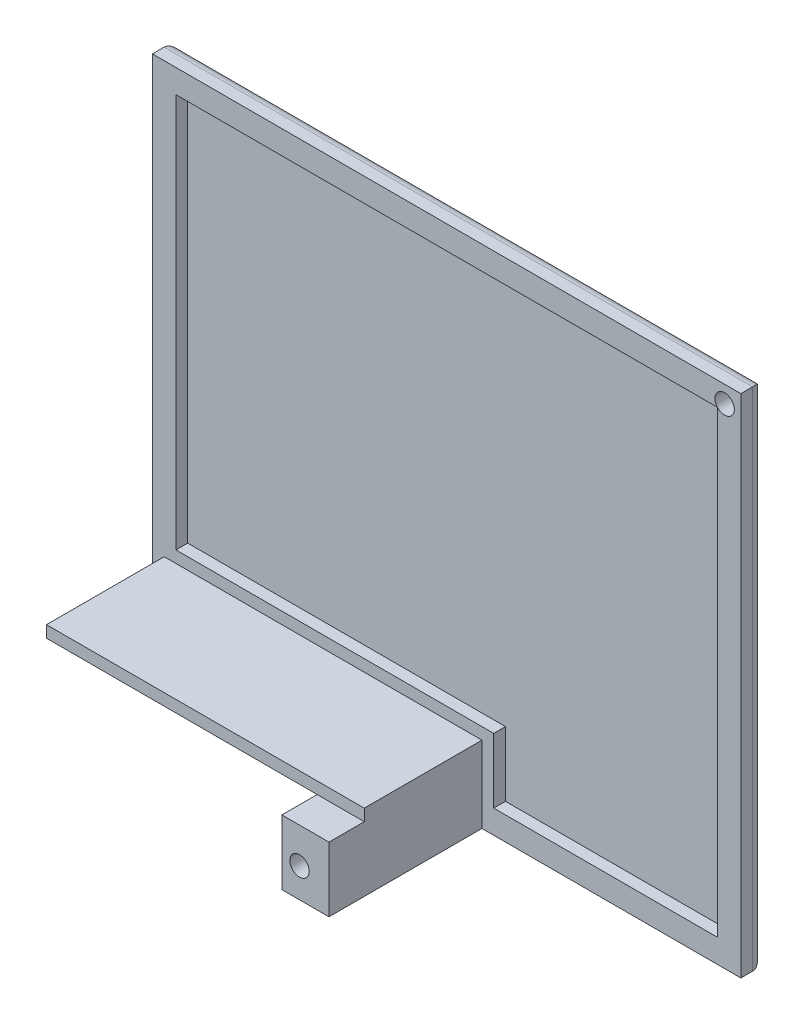
ISO-10303-21;
HEADER;
FILE_DESCRIPTION(('STEP AP214'),'2;1');
FILE_NAME('part.step','',(''),(''),'','','');
FILE_SCHEMA(('AUTOMOTIVE_DESIGN { 1 0 10303 214 1 1 1 1 }'));
ENDSEC;
DATA;
#1=APPLICATION_CONTEXT('core data for automotive mechanical design processes');
#2=APPLICATION_PROTOCOL_DEFINITION('international standard','automotive_design',2000,#1);
#3=PRODUCT_CONTEXT('',#1,'mechanical');
#4=PRODUCT('Part','Part','',(#3));
#5=PRODUCT_RELATED_PRODUCT_CATEGORY('part','',(#4));
#6=PRODUCT_DEFINITION_FORMATION('','',#4);
#7=PRODUCT_DEFINITION_CONTEXT('part definition',#1,'design');
#8=PRODUCT_DEFINITION('design','',#6,#7);
#9=PRODUCT_DEFINITION_SHAPE('','',#8);
#10=(LENGTH_UNIT() NAMED_UNIT(*) SI_UNIT(.MILLI.,.METRE.));
#11=(NAMED_UNIT(*) PLANE_ANGLE_UNIT() SI_UNIT($,.RADIAN.));
#12=(NAMED_UNIT(*) SI_UNIT($,.STERADIAN.) SOLID_ANGLE_UNIT());
#13=UNCERTAINTY_MEASURE_WITH_UNIT(LENGTH_MEASURE(1.E-05),#10,'distance_accuracy_value','');
#14=(GEOMETRIC_REPRESENTATION_CONTEXT(3) GLOBAL_UNCERTAINTY_ASSIGNED_CONTEXT((#13)) GLOBAL_UNIT_ASSIGNED_CONTEXT((#10,
#11,#12)) REPRESENTATION_CONTEXT('',''));
#15=CARTESIAN_POINT('',(0.,0.,0.));
#16=DIRECTION('',(0.,0.,1.));
#17=DIRECTION('',(1.,0.,0.));
#18=AXIS2_PLACEMENT_3D('',#15,#16,#17);
#19=CARTESIAN_POINT('',(0.,0.,-45.));
#20=DIRECTION('',(0.,0.,-1.));
#21=DIRECTION('',(-1.,0.,0.));
#22=AXIS2_PLACEMENT_3D('',#19,#20,#21);
#23=PLANE('',#22);
#24=DIRECTION('',(1.,0.,0.));
#25=VECTOR('',#24,1.);
#26=CARTESIAN_POINT('',(-64.6376811594203,62.9565217391305,-45.));
#27=LINE('',#26,#25);
#28=CARTESIAN_POINT('',(-64.6376811594203,62.9565217391305,-45.));
#29=VERTEX_POINT('',#28);
#30=CARTESIAN_POINT('',(35.3623188405797,62.9565217391305,-45.));
#31=VERTEX_POINT('',#30);
#32=EDGE_CURVE('E547',#29,#31,#27,.T.);
#33=ORIENTED_EDGE('',*,*,#32,.F.);
#34=DIRECTION('',(0.,1.,0.));
#35=VECTOR('',#34,1.);
#36=CARTESIAN_POINT('',(-64.6376811594203,62.9565217391305,-45.));
#37=LINE('',#36,#35);
#38=CARTESIAN_POINT('',(-64.6376811594203,-12.0434782608695,-45.));
#39=VERTEX_POINT('',#38);
#40=EDGE_CURVE('E282',#39,#29,#37,.T.);
#41=ORIENTED_EDGE('',*,*,#40,.F.);
#42=DIRECTION('',(1.,0.,0.));
#43=VECTOR('',#42,1.);
#44=CARTESIAN_POINT('',(-8.6376811594203,-12.0434782608695,-45.));
#45=LINE('',#44,#43);
#46=CARTESIAN_POINT('',(-62.6376811594203,-12.0434782608695,-45.));
#47=VERTEX_POINT('',#46);
#48=EDGE_CURVE('E285',#39,#47,#45,.T.);
#49=ORIENTED_EDGE('',*,*,#48,.T.);
#50=DIRECTION('',(0.,1.,0.));
#51=VECTOR('',#50,1.);
#52=CARTESIAN_POINT('',(-62.6376811594203,-21.0434782608695,-45.));
#53=LINE('',#52,#51);
#54=CARTESIAN_POINT('',(-62.6376811594203,-10.0434782608695,-45.));
#55=VERTEX_POINT('',#54);
#56=EDGE_CURVE('E275',#47,#55,#53,.T.);
#57=ORIENTED_EDGE('',*,*,#56,.T.);
#58=DIRECTION('',(1.,0.,0.));
#59=VECTOR('',#58,1.);
#60=CARTESIAN_POINT('',(0.,-10.0434782608695,-45.));
#61=LINE('',#60,#59);
#62=CARTESIAN_POINT('',(-8.6376811594203,-10.0434782608695,-45.));
#63=VERTEX_POINT('',#62);
#64=EDGE_CURVE('E318',#55,#63,#61,.T.);
#65=ORIENTED_EDGE('',*,*,#64,.T.);
#66=DIRECTION('',(0.,-1.,0.));
#67=VECTOR('',#66,1.);
#68=CARTESIAN_POINT('',(-8.6376811594203,0.,-45.));
#69=LINE('',#68,#67);
#70=CARTESIAN_POINT('',(-8.6376811594203,-23.0434782608695,-45.));
#71=VERTEX_POINT('',#70);
#72=EDGE_CURVE('E544',#63,#71,#69,.T.);
#73=ORIENTED_EDGE('',*,*,#72,.T.);
#74=DIRECTION('',(-1.,0.,0.));
#75=VECTOR('',#74,1.);
#76=CARTESIAN_POINT('',(-64.6376811594203,-23.0434782608695,-45.));
#77=LINE('',#76,#75);
#78=CARTESIAN_POINT('',(35.3623188405797,-23.0434782608695,-45.));
#79=VERTEX_POINT('',#78);
#80=EDGE_CURVE('E334',#79,#71,#77,.T.);
#81=ORIENTED_EDGE('',*,*,#80,.F.);
#82=DIRECTION('',(0.,-1.,0.));
#83=VECTOR('',#82,1.);
#84=CARTESIAN_POINT('',(35.3623188405797,62.9565217391305,-45.));
#85=LINE('',#84,#83);
#86=EDGE_CURVE('E346',#31,#79,#85,.T.);
#87=ORIENTED_EDGE('',*,*,#86,.F.);
#88=EDGE_LOOP('',(#33,#41,#49,#57,#65,#73,#81,#87));
#89=FACE_BOUND('',#88,.T.);
#90=CARTESIAN_POINT('',(32.6005254813833,60.0629949220613,-45.));
#91=DIRECTION('',(0.,0.,-1.));
#92=DIRECTION('',(-1.,0.,0.));
#93=AXIS2_PLACEMENT_3D('',#90,#91,#92);
#94=CIRCLE('',#93,1.65);
#95=CARTESIAN_POINT('',(30.9505254813833,60.0629949220613,-45.));
#96=VERTEX_POINT('',#95);
#97=EDGE_CURVE('E251',#96,#96,#94,.T.);
#98=ORIENTED_EDGE('',*,*,#97,.T.);
#99=EDGE_LOOP('',(#98));
#100=FACE_BOUND('',#99,.T.);
#101=DIRECTION('',(0.,-1.,0.));
#102=VECTOR('',#101,1.);
#103=CARTESIAN_POINT('',(31.3623188405797,-8.04347826086955,-45.));
#104=LINE('',#103,#102);
#105=CARTESIAN_POINT('',(31.3623188405797,58.9565217391305,-45.));
#106=VERTEX_POINT('',#105);
#107=CARTESIAN_POINT('',(31.3623188405797,-19.0434782608695,-45.));
#108=VERTEX_POINT('',#107);
#109=EDGE_CURVE('E226',#106,#108,#104,.T.);
#110=ORIENTED_EDGE('',*,*,#109,.T.);
#111=DIRECTION('',(-1.,0.,0.));
#112=VECTOR('',#111,1.);
#113=CARTESIAN_POINT('',(31.3623188405797,-19.0434782608695,-45.));
#114=LINE('',#113,#112);
#115=CARTESIAN_POINT('',(-6.63768115942029,-19.0434782608695,-45.));
#116=VERTEX_POINT('',#115);
#117=EDGE_CURVE('E208',#108,#116,#114,.T.);
#118=ORIENTED_EDGE('',*,*,#117,.T.);
#119=DIRECTION('',(0.,1.,0.));
#120=VECTOR('',#119,1.);
#121=CARTESIAN_POINT('',(-6.63768115942029,-8.04347826086954,-45.));
#122=LINE('',#121,#120);
#123=CARTESIAN_POINT('',(-6.63768115942029,-8.04347826086954,-45.));
#124=VERTEX_POINT('',#123);
#125=EDGE_CURVE('E229',#116,#124,#122,.T.);
#126=ORIENTED_EDGE('',*,*,#125,.T.);
#127=DIRECTION('',(-1.,0.,0.));
#128=VECTOR('',#127,1.);
#129=CARTESIAN_POINT('',(-6.63768115942029,-8.04347826086954,-45.));
#130=LINE('',#129,#128);
#131=CARTESIAN_POINT('',(-60.6376811594203,-8.04347826086955,-45.));
#132=VERTEX_POINT('',#131);
#133=EDGE_CURVE('E232',#124,#132,#130,.T.);
#134=ORIENTED_EDGE('',*,*,#133,.T.);
#135=DIRECTION('',(0.,1.,0.));
#136=VECTOR('',#135,1.);
#137=CARTESIAN_POINT('',(-60.6376811594203,58.9565217391305,-45.));
#138=LINE('',#137,#136);
#139=CARTESIAN_POINT('',(-60.6376811594203,58.9565217391305,-45.));
#140=VERTEX_POINT('',#139);
#141=EDGE_CURVE('E235',#132,#140,#138,.T.);
#142=ORIENTED_EDGE('',*,*,#141,.T.);
#143=DIRECTION('',(1.,0.,0.));
#144=VECTOR('',#143,1.);
#145=CARTESIAN_POINT('',(31.3623188405797,58.9565217391305,-45.));
#146=LINE('',#145,#144);
#147=EDGE_CURVE('E202',#140,#106,#146,.T.);
#148=ORIENTED_EDGE('',*,*,#147,.T.);
#149=EDGE_LOOP('',(#110,#118,#126,#134,#142,#148));
#150=FACE_BOUND('',#149,.T.);
#151=ADVANCED_FACE('F32',(#89,#100,#150),#23,.F.);
#152=CARTESIAN_POINT('',(-8.6376811594203,-12.0434782608695,-53.));
#153=DIRECTION('',(0.,-1.,0.));
#154=DIRECTION('',(0.,0.,-1.));
#155=AXIS2_PLACEMENT_3D('',#152,#153,#154);
#156=PLANE('',#155);
#157=DIRECTION('',(0.,0.,1.));
#158=VECTOR('',#157,1.);
#159=CARTESIAN_POINT('',(-64.6376811594203,-12.0434782608695,-53.));
#160=LINE('',#159,#158);
#161=CARTESIAN_POINT('',(-64.6376811594203,-12.0434782608695,-47.));
#162=VERTEX_POINT('',#161);
#163=EDGE_CURVE('E276',#162,#39,#160,.T.);
#164=ORIENTED_EDGE('',*,*,#163,.F.);
#165=DIRECTION('',(-1.,0.,0.));
#166=VECTOR('',#165,1.);
#167=CARTESIAN_POINT('',(-8.6376811594203,-12.0434782608695,-47.));
#168=LINE('',#167,#166);
#169=CARTESIAN_POINT('',(-10.6376811594203,-12.0434782608695,-47.));
#170=VERTEX_POINT('',#169);
#171=EDGE_CURVE('E387',#162,#170,#168,.F.);
#172=ORIENTED_EDGE('',*,*,#171,.T.);
#173=DIRECTION('',(0.,0.,-1.));
#174=VECTOR('',#173,1.);
#175=CARTESIAN_POINT('',(-10.6376811594203,-12.0434782608695,-21.));
#176=LINE('',#175,#174);
#177=CARTESIAN_POINT('',(-10.6376811594203,-12.0434782608695,-27.));
#178=VERTEX_POINT('',#177);
#179=EDGE_CURVE('E322',#178,#170,#176,.T.);
#180=ORIENTED_EDGE('',*,*,#179,.F.);
#181=DIRECTION('',(1.,0.,0.));
#182=VECTOR('',#181,1.);
#183=CARTESIAN_POINT('',(-10.6376811594203,-12.0434782608695,-27.));
#184=LINE('',#183,#182);
#185=CARTESIAN_POINT('',(-16.6376811594203,-12.0434782608695,-27.));
#186=VERTEX_POINT('',#185);
#187=EDGE_CURVE('E269',#186,#178,#184,.T.);
#188=ORIENTED_EDGE('',*,*,#187,.F.);
#189=DIRECTION('',(0.,0.,1.));
#190=VECTOR('',#189,1.);
#191=CARTESIAN_POINT('',(-16.6376811594203,-12.0434782608695,-27.));
#192=LINE('',#191,#190);
#193=CARTESIAN_POINT('',(-16.6376811594203,-12.0434782608695,-25.));
#194=VERTEX_POINT('',#193);
#195=EDGE_CURVE('E272',#186,#194,#192,.T.);
#196=ORIENTED_EDGE('',*,*,#195,.T.);
#197=DIRECTION('',(-1.,0.,0.));
#198=VECTOR('',#197,1.);
#199=CARTESIAN_POINT('',(-8.63768115942029,-12.0434782608695,-25.));
#200=LINE('',#199,#198);
#201=CARTESIAN_POINT('',(-62.6376811594203,-12.0434782608695,-25.));
#202=VERTEX_POINT('',#201);
#203=EDGE_CURVE('E294',#194,#202,#200,.T.);
#204=ORIENTED_EDGE('',*,*,#203,.T.);
#205=DIRECTION('',(0.,0.,-1.));
#206=VECTOR('',#205,1.);
#207=CARTESIAN_POINT('',(-62.6376811594203,-12.0434782608695,-53.));
#208=LINE('',#207,#206);
#209=EDGE_CURVE('E331',#202,#47,#208,.T.);
#210=ORIENTED_EDGE('',*,*,#209,.T.);
#211=ORIENTED_EDGE('',*,*,#48,.F.);
#212=EDGE_LOOP('',(#164,#172,#180,#188,#196,#204,#210,#211));
#213=FACE_BOUND('',#212,.T.);
#214=ADVANCED_FACE('F374',(#213),#156,.T.);
#215=CARTESIAN_POINT('',(-10.6376811594203,-23.0434782608695,-21.));
#216=DIRECTION('',(-1.,0.,0.));
#217=DIRECTION('',(0.,0.,1.));
#218=AXIS2_PLACEMENT_3D('',#215,#216,#217);
#219=PLANE('',#218);
#220=ORIENTED_EDGE('',*,*,#179,.T.);
#221=DIRECTION('',(0.,1.,0.));
#222=VECTOR('',#221,1.);
#223=CARTESIAN_POINT('',(-10.6376811594203,-23.0434782608695,-47.));
#224=LINE('',#223,#222);
#225=CARTESIAN_POINT('',(-10.6376811594203,-23.0434782608695,-47.));
#226=VERTEX_POINT('',#225);
#227=EDGE_CURVE('E406',#170,#226,#224,.F.);
#228=ORIENTED_EDGE('',*,*,#227,.T.);
#229=DIRECTION('',(0.,0.,-1.));
#230=VECTOR('',#229,1.);
#231=CARTESIAN_POINT('',(-10.6376811594203,-23.0434782608695,-21.));
#232=LINE('',#231,#230);
#233=CARTESIAN_POINT('',(-10.6376811594203,-23.0434782608695,-27.));
#234=VERTEX_POINT('',#233);
#235=EDGE_CURVE('E301',#234,#226,#232,.T.);
#236=ORIENTED_EDGE('',*,*,#235,.F.);
#237=DIRECTION('',(0.,-1.,0.));
#238=VECTOR('',#237,1.);
#239=CARTESIAN_POINT('',(-10.6376811594203,-23.0434782608695,-27.));
#240=LINE('',#239,#238);
#241=EDGE_CURVE('E260',#178,#234,#240,.T.);
#242=ORIENTED_EDGE('',*,*,#241,.F.);
#243=EDGE_LOOP('',(#220,#228,#236,#242));
#244=FACE_BOUND('',#243,.T.);
#245=ADVANCED_FACE('F452',(#244),#219,.T.);
#246=CARTESIAN_POINT('',(-64.6376811594203,-23.0434782608695,2.));
#247=DIRECTION('',(0.,1.,0.));
#248=DIRECTION('',(0.,0.,1.));
#249=AXIS2_PLACEMENT_3D('',#246,#247,#248);
#250=PLANE('',#249);
#251=ORIENTED_EDGE('',*,*,#235,.T.);
#252=DIRECTION('',(-1.,0.,0.));
#253=VECTOR('',#252,1.);
#254=CARTESIAN_POINT('',(35.3623188405797,-23.0434782608695,-47.));
#255=LINE('',#254,#253);
#256=CARTESIAN_POINT('',(35.3623188405797,-23.0434782608695,-47.));
#257=VERTEX_POINT('',#256);
#258=EDGE_CURVE('E11',#226,#257,#255,.F.);
#259=ORIENTED_EDGE('',*,*,#258,.T.);
#260=DIRECTION('',(0.,0.,-1.));
#261=VECTOR('',#260,1.);
#262=CARTESIAN_POINT('',(35.3623188405797,-23.0434782608695,2.));
#263=LINE('',#262,#261);
#264=EDGE_CURVE('E546',#79,#257,#263,.T.);
#265=ORIENTED_EDGE('',*,*,#264,.F.);
#266=ORIENTED_EDGE('',*,*,#80,.T.);
#267=DIRECTION('',(0.,0.,-1.));
#268=VECTOR('',#267,1.);
#269=CARTESIAN_POINT('',(-8.6376811594203,-23.0434782608695,2.));
#270=LINE('',#269,#268);
#271=CARTESIAN_POINT('',(-8.6376811594203,-23.0434782608695,-19.));
#272=VERTEX_POINT('',#271);
#273=EDGE_CURVE('E343',#272,#71,#270,.T.);
#274=ORIENTED_EDGE('',*,*,#273,.F.);
#275=DIRECTION('',(1.,0.,0.));
#276=VECTOR('',#275,1.);
#277=CARTESIAN_POINT('',(-64.6376811594203,-23.0434782608695,-19.));
#278=LINE('',#277,#276);
#279=CARTESIAN_POINT('',(-16.6376811594203,-23.0434782608695,-19.));
#280=VERTEX_POINT('',#279);
#281=EDGE_CURVE('E345',#280,#272,#278,.T.);
#282=ORIENTED_EDGE('',*,*,#281,.F.);
#283=DIRECTION('',(0.,0.,1.));
#284=VECTOR('',#283,1.);
#285=CARTESIAN_POINT('',(-16.6376811594203,-23.0434782608695,-21.));
#286=LINE('',#285,#284);
#287=CARTESIAN_POINT('',(-16.6376811594203,-23.0434782608695,-27.));
#288=VERTEX_POINT('',#287);
#289=EDGE_CURVE('E299',#288,#280,#286,.T.);
#290=ORIENTED_EDGE('',*,*,#289,.F.);
#291=DIRECTION('',(-1.,0.,0.));
#292=VECTOR('',#291,1.);
#293=CARTESIAN_POINT('',(-10.6376811594203,-23.0434782608695,-27.));
#294=LINE('',#293,#292);
#295=EDGE_CURVE('E263',#234,#288,#294,.T.);
#296=ORIENTED_EDGE('',*,*,#295,.F.);
#297=EDGE_LOOP('',(#251,#259,#265,#266,#274,#282,#290,#296));
#298=FACE_BOUND('',#297,.T.);
#299=ADVANCED_FACE('F455',(#298),#250,.F.);
#300=CARTESIAN_POINT('',(35.3623188405797,62.9565217391305,2.));
#301=DIRECTION('',(-1.,0.,0.));
#302=DIRECTION('',(0.,-1.,0.));
#303=AXIS2_PLACEMENT_3D('',#300,#301,#302);
#304=PLANE('',#303);
#305=ORIENTED_EDGE('',*,*,#264,.T.);
#306=DIRECTION('',(0.,-1.,0.));
#307=VECTOR('',#306,1.);
#308=CARTESIAN_POINT('',(35.3623188405797,62.9565217391305,-47.));
#309=LINE('',#308,#307);
#310=CARTESIAN_POINT('',(35.3623188405797,62.9565217391305,-47.));
#311=VERTEX_POINT('',#310);
#312=EDGE_CURVE('E42',#257,#311,#309,.F.);
#313=ORIENTED_EDGE('',*,*,#312,.T.);
#314=DIRECTION('',(0.,0.,-1.));
#315=VECTOR('',#314,1.);
#316=CARTESIAN_POINT('',(35.3623188405797,62.9565217391305,2.));
#317=LINE('',#316,#315);
#318=EDGE_CURVE('E539',#31,#311,#317,.T.);
#319=ORIENTED_EDGE('',*,*,#318,.F.);
#320=ORIENTED_EDGE('',*,*,#86,.T.);
#321=EDGE_LOOP('',(#305,#313,#319,#320));
#322=FACE_BOUND('',#321,.T.);
#323=ADVANCED_FACE('F474',(#322),#304,.F.);
#324=CARTESIAN_POINT('',(-64.6376811594203,62.9565217391305,2.));
#325=DIRECTION('',(0.,-1.,0.));
#326=DIRECTION('',(0.,0.,-1.));
#327=AXIS2_PLACEMENT_3D('',#324,#325,#326);
#328=PLANE('',#327);
#329=ORIENTED_EDGE('',*,*,#318,.T.);
#330=DIRECTION('',(1.,0.,0.));
#331=VECTOR('',#330,1.);
#332=CARTESIAN_POINT('',(-64.6376811594203,62.9565217391305,-47.));
#333=LINE('',#332,#331);
#334=CARTESIAN_POINT('',(-64.6376811594203,62.9565217391305,-47.));
#335=VERTEX_POINT('',#334);
#336=EDGE_CURVE('E522',#311,#335,#333,.F.);
#337=ORIENTED_EDGE('',*,*,#336,.T.);
#338=DIRECTION('',(0.,0.,-1.));
#339=VECTOR('',#338,1.);
#340=CARTESIAN_POINT('',(-64.6376811594203,62.9565217391305,2.));
#341=LINE('',#340,#339);
#342=EDGE_CURVE('E279',#29,#335,#341,.T.);
#343=ORIENTED_EDGE('',*,*,#342,.F.);
#344=ORIENTED_EDGE('',*,*,#32,.T.);
#345=EDGE_LOOP('',(#329,#337,#343,#344));
#346=FACE_BOUND('',#345,.T.);
#347=ADVANCED_FACE('F477',(#346),#328,.F.);
#348=CARTESIAN_POINT('',(0.,0.,-49.));
#349=DIRECTION('',(0.,0.,-1.));
#350=DIRECTION('',(-1.,0.,0.));
#351=AXIS2_PLACEMENT_3D('',#348,#349,#350);
#352=PLANE('',#351);
#353=DIRECTION('',(0.,1.,0.));
#354=VECTOR('',#353,1.);
#355=CARTESIAN_POINT('',(-62.6376811594203,62.9565217391305,-49.));
#356=LINE('',#355,#354);
#357=CARTESIAN_POINT('',(-62.6376811594203,-10.0434782608695,-49.));
#358=VERTEX_POINT('',#357);
#359=CARTESIAN_POINT('',(-62.6376811594203,60.9565217391305,-49.));
#360=VERTEX_POINT('',#359);
#361=EDGE_CURVE('E398',#358,#360,#356,.T.);
#362=ORIENTED_EDGE('',*,*,#361,.T.);
#363=DIRECTION('',(1.,0.,0.));
#364=VECTOR('',#363,1.);
#365=CARTESIAN_POINT('',(35.3623188405797,60.9565217391305,-49.));
#366=LINE('',#365,#364);
#367=CARTESIAN_POINT('',(31.2134026219443,60.9565217391305,-49.));
#368=VERTEX_POINT('',#367);
#369=EDGE_CURVE('E411',#360,#368,#366,.T.);
#370=ORIENTED_EDGE('',*,*,#369,.T.);
#371=CARTESIAN_POINT('',(32.6005254813833,60.0629949220613,-49.));
#372=DIRECTION('',(0.,0.,-1.));
#373=DIRECTION('',(-1.,0.,0.));
#374=AXIS2_PLACEMENT_3D('',#371,#372,#373);
#375=CIRCLE('',#374,1.65);
#376=CARTESIAN_POINT('',(33.3623188405797,58.5993792355219,-49.));
#377=VERTEX_POINT('',#376);
#378=EDGE_CURVE('E248',#377,#368,#375,.T.);
#379=ORIENTED_EDGE('',*,*,#378,.F.);
#380=DIRECTION('',(0.,-1.,0.));
#381=VECTOR('',#380,1.);
#382=CARTESIAN_POINT('',(33.3623188405797,-23.0434782608695,-49.));
#383=LINE('',#382,#381);
#384=CARTESIAN_POINT('',(33.3623188405797,-21.0434782608695,-49.));
#385=VERTEX_POINT('',#384);
#386=EDGE_CURVE('E535',#377,#385,#383,.T.);
#387=ORIENTED_EDGE('',*,*,#386,.T.);
#388=DIRECTION('',(-1.,0.,0.));
#389=VECTOR('',#388,1.);
#390=CARTESIAN_POINT('',(-10.6376811594203,-21.0434782608695,-49.));
#391=LINE('',#390,#389);
#392=CARTESIAN_POINT('',(-8.6376811594203,-21.0434782608695,-49.));
#393=VERTEX_POINT('',#392);
#394=EDGE_CURVE('E537',#385,#393,#391,.T.);
#395=ORIENTED_EDGE('',*,*,#394,.T.);
#396=DIRECTION('',(0.,1.,0.));
#397=VECTOR('',#396,1.);
#398=CARTESIAN_POINT('',(-8.6376811594203,0.,-49.));
#399=LINE('',#398,#397);
#400=CARTESIAN_POINT('',(-8.6376811594203,-10.0434782608695,-49.));
#401=VERTEX_POINT('',#400);
#402=EDGE_CURVE('E532',#393,#401,#399,.T.);
#403=ORIENTED_EDGE('',*,*,#402,.T.);
#404=DIRECTION('',(-1.,0.,0.));
#405=VECTOR('',#404,1.);
#406=CARTESIAN_POINT('',(0.,-10.0434782608695,-49.));
#407=LINE('',#406,#405);
#408=EDGE_CURVE('E528',#401,#358,#407,.T.);
#409=ORIENTED_EDGE('',*,*,#408,.T.);
#410=EDGE_LOOP('',(#362,#370,#379,#387,#395,#403,#409));
#411=FACE_BOUND('',#410,.T.);
#412=ADVANCED_FACE('F457',(#411),#352,.T.);
#413=CARTESIAN_POINT('',(-8.6376811594203,-12.0434782608695,-11.));
#414=DIRECTION('',(1.,0.,0.));
#415=DIRECTION('',(0.,0.,-1.));
#416=AXIS2_PLACEMENT_3D('',#413,#414,#415);
#417=PLANE('',#416);
#418=ORIENTED_EDGE('',*,*,#72,.F.);
#419=DIRECTION('',(0.,0.,-1.));
#420=VECTOR('',#419,1.);
#421=CARTESIAN_POINT('',(-8.63768115942029,-10.0434782608695,-25.));
#422=LINE('',#421,#420);
#423=CARTESIAN_POINT('',(-8.63768115942029,-10.0434782608695,-25.));
#424=VERTEX_POINT('',#423);
#425=EDGE_CURVE('E308',#424,#63,#422,.T.);
#426=ORIENTED_EDGE('',*,*,#425,.F.);
#427=DIRECTION('',(0.,-1.,0.));
#428=VECTOR('',#427,1.);
#429=CARTESIAN_POINT('',(-8.63768115942029,-10.0434782608695,-25.));
#430=LINE('',#429,#428);
#431=CARTESIAN_POINT('',(-8.63768115942029,-12.0434782608695,-25.));
#432=VERTEX_POINT('',#431);
#433=EDGE_CURVE('E303',#424,#432,#430,.T.);
#434=ORIENTED_EDGE('',*,*,#433,.T.);
#435=DIRECTION('',(0.,0.,-1.));
#436=VECTOR('',#435,1.);
#437=CARTESIAN_POINT('',(-8.6376811594203,-12.0434782608695,-11.));
#438=LINE('',#437,#436);
#439=CARTESIAN_POINT('',(-8.6376811594203,-12.0434782608695,-19.));
#440=VERTEX_POINT('',#439);
#441=EDGE_CURVE('E309',#440,#432,#438,.T.);
#442=ORIENTED_EDGE('',*,*,#441,.F.);
#443=DIRECTION('',(0.,-1.,0.));
#444=VECTOR('',#443,1.);
#445=CARTESIAN_POINT('',(-8.6376811594203,62.9665217391304,-19.));
#446=LINE('',#445,#444);
#447=EDGE_CURVE('E351',#440,#272,#446,.T.);
#448=ORIENTED_EDGE('',*,*,#447,.T.);
#449=ORIENTED_EDGE('',*,*,#273,.T.);
#450=EDGE_LOOP('',(#418,#426,#434,#442,#448,#449));
#451=FACE_BOUND('',#450,.T.);
#452=ADVANCED_FACE('F364',(#451),#417,.T.);
#453=CARTESIAN_POINT('',(-62.6376811594203,62.9665217391304,-49.));
#454=DIRECTION('',(-1.,0.,0.));
#455=DIRECTION('',(0.,0.,1.));
#456=AXIS2_PLACEMENT_3D('',#453,#454,#455);
#457=PLANE('',#456);
#458=ORIENTED_EDGE('',*,*,#56,.F.);
#459=ORIENTED_EDGE('',*,*,#209,.F.);
#460=DIRECTION('',(0.,1.,0.));
#461=VECTOR('',#460,1.);
#462=CARTESIAN_POINT('',(-62.6376811594203,-21.0434782608695,-25.));
#463=LINE('',#462,#461);
#464=CARTESIAN_POINT('',(-62.6376811594203,-10.0434782608695,-25.));
#465=VERTEX_POINT('',#464);
#466=EDGE_CURVE('E278',#202,#465,#463,.T.);
#467=ORIENTED_EDGE('',*,*,#466,.T.);
#468=DIRECTION('',(0.,0.,1.));
#469=VECTOR('',#468,1.);
#470=CARTESIAN_POINT('',(-62.6376811594203,-10.0434782608695,-45.));
#471=LINE('',#470,#469);
#472=EDGE_CURVE('E293',#55,#465,#471,.T.);
#473=ORIENTED_EDGE('',*,*,#472,.F.);
#474=EDGE_LOOP('',(#458,#459,#467,#473));
#475=FACE_BOUND('',#474,.T.);
#476=ADVANCED_FACE('F378',(#475),#457,.T.);
#477=CARTESIAN_POINT('',(-10.6376811594203,62.9665217391304,-19.));
#478=DIRECTION('',(0.,0.,1.));
#479=DIRECTION('',(1.,0.,0.));
#480=AXIS2_PLACEMENT_3D('',#477,#478,#479);
#481=PLANE('',#480);
#482=CARTESIAN_POINT('',(-13.6376811594203,-18.0434782608695,-19.));
#483=DIRECTION('',(0.,0.,1.));
#484=DIRECTION('',(1.,0.,0.));
#485=AXIS2_PLACEMENT_3D('',#482,#483,#484);
#486=CIRCLE('',#485,1.65);
#487=CARTESIAN_POINT('',(-11.9876811594203,-18.0434782608695,-19.));
#488=VERTEX_POINT('',#487);
#489=EDGE_CURVE('E257',#488,#488,#486,.T.);
#490=ORIENTED_EDGE('',*,*,#489,.F.);
#491=EDGE_LOOP('',(#490));
#492=FACE_BOUND('',#491,.T.);
#493=DIRECTION('',(1.,0.,0.));
#494=VECTOR('',#493,1.);
#495=CARTESIAN_POINT('',(-8.6376811594203,-12.0434782608695,-19.));
#496=LINE('',#495,#494);
#497=CARTESIAN_POINT('',(-16.6376811594203,-12.0434782608695,-19.));
#498=VERTEX_POINT('',#497);
#499=EDGE_CURVE('E312',#498,#440,#496,.T.);
#500=ORIENTED_EDGE('',*,*,#499,.F.);
#501=DIRECTION('',(0.,-1.,0.));
#502=VECTOR('',#501,1.);
#503=CARTESIAN_POINT('',(-16.6376811594203,-23.0434782608695,-19.));
#504=LINE('',#503,#502);
#505=EDGE_CURVE('E315',#498,#280,#504,.T.);
#506=ORIENTED_EDGE('',*,*,#505,.T.);
#507=ORIENTED_EDGE('',*,*,#281,.T.);
#508=ORIENTED_EDGE('',*,*,#447,.F.);
#509=EDGE_LOOP('',(#500,#506,#507,#508));
#510=FACE_BOUND('',#509,.T.);
#511=ADVANCED_FACE('F362',(#492,#510),#481,.T.);
#512=CARTESIAN_POINT('',(-16.6376811594203,-23.0434782608695,-21.));
#513=DIRECTION('',(1.,0.,0.));
#514=DIRECTION('',(0.,0.,-1.));
#515=AXIS2_PLACEMENT_3D('',#512,#513,#514);
#516=PLANE('',#515);
#517=ORIENTED_EDGE('',*,*,#505,.F.);
#518=DIRECTION('',(0.,0.,1.));
#519=VECTOR('',#518,1.);
#520=CARTESIAN_POINT('',(-16.6376811594203,-12.0434782608695,-21.));
#521=LINE('',#520,#519);
#522=EDGE_CURVE('E297',#194,#498,#521,.T.);
#523=ORIENTED_EDGE('',*,*,#522,.F.);
#524=ORIENTED_EDGE('',*,*,#195,.F.);
#525=DIRECTION('',(0.,1.,0.));
#526=VECTOR('',#525,1.);
#527=CARTESIAN_POINT('',(-16.6376811594203,-23.0434782608695,-27.));
#528=LINE('',#527,#526);
#529=EDGE_CURVE('E266',#288,#186,#528,.T.);
#530=ORIENTED_EDGE('',*,*,#529,.F.);
#531=ORIENTED_EDGE('',*,*,#289,.T.);
#532=EDGE_LOOP('',(#517,#523,#524,#530,#531));
#533=FACE_BOUND('',#532,.T.);
#534=ADVANCED_FACE('F447',(#533),#516,.F.);
#535=CARTESIAN_POINT('',(-8.63768115942029,-10.0434782608695,-25.));
#536=DIRECTION('',(0.,1.,0.));
#537=DIRECTION('',(0.,0.,1.));
#538=AXIS2_PLACEMENT_3D('',#535,#536,#537);
#539=PLANE('',#538);
#540=ORIENTED_EDGE('',*,*,#64,.F.);
#541=ORIENTED_EDGE('',*,*,#472,.T.);
#542=DIRECTION('',(1.,0.,0.));
#543=VECTOR('',#542,1.);
#544=CARTESIAN_POINT('',(-8.63768115942029,-10.0434782608695,-25.));
#545=LINE('',#544,#543);
#546=EDGE_CURVE('E306',#465,#424,#545,.T.);
#547=ORIENTED_EDGE('',*,*,#546,.T.);
#548=ORIENTED_EDGE('',*,*,#425,.T.);
#549=EDGE_LOOP('',(#540,#541,#547,#548));
#550=FACE_BOUND('',#549,.T.);
#551=ADVANCED_FACE('F450',(#550),#539,.T.);
#552=CARTESIAN_POINT('',(0.,0.,-25.));
#553=DIRECTION('',(0.,0.,-1.));
#554=DIRECTION('',(-1.,0.,0.));
#555=AXIS2_PLACEMENT_3D('',#552,#553,#554);
#556=PLANE('',#555);
#557=ORIENTED_EDGE('',*,*,#546,.F.);
#558=ORIENTED_EDGE('',*,*,#466,.F.);
#559=ORIENTED_EDGE('',*,*,#203,.F.);
#560=EDGE_CURVE('E290',#432,#194,#200,.T.);
#561=ORIENTED_EDGE('',*,*,#560,.F.);
#562=ORIENTED_EDGE('',*,*,#433,.F.);
#563=EDGE_LOOP('',(#557,#558,#559,#561,#562));
#564=FACE_BOUND('',#563,.T.);
#565=ADVANCED_FACE('F368',(#564),#556,.F.);
#566=CARTESIAN_POINT('',(-8.6376811594203,-12.0434782608695,-11.));
#567=DIRECTION('',(0.,1.,0.));
#568=DIRECTION('',(0.,0.,1.));
#569=AXIS2_PLACEMENT_3D('',#566,#567,#568);
#570=PLANE('',#569);
#571=ORIENTED_EDGE('',*,*,#441,.T.);
#572=ORIENTED_EDGE('',*,*,#560,.T.);
#573=ORIENTED_EDGE('',*,*,#522,.T.);
#574=ORIENTED_EDGE('',*,*,#499,.T.);
#575=EDGE_LOOP('',(#571,#572,#573,#574));
#576=FACE_BOUND('',#575,.T.);
#577=ADVANCED_FACE('F358',(#576),#570,.T.);
#578=CARTESIAN_POINT('',(-64.6376811594203,62.9565217391305,2.));
#579=DIRECTION('',(1.,0.,0.));
#580=DIRECTION('',(0.,1.,0.));
#581=AXIS2_PLACEMENT_3D('',#578,#579,#580);
#582=PLANE('',#581);
#583=ORIENTED_EDGE('',*,*,#342,.T.);
#584=DIRECTION('',(0.,1.,0.));
#585=VECTOR('',#584,1.);
#586=CARTESIAN_POINT('',(-64.6376811594203,-12.0434782608695,-47.));
#587=LINE('',#586,#585);
#588=EDGE_CURVE('E397',#335,#162,#587,.F.);
#589=ORIENTED_EDGE('',*,*,#588,.T.);
#590=ORIENTED_EDGE('',*,*,#163,.T.);
#591=ORIENTED_EDGE('',*,*,#40,.T.);
#592=EDGE_LOOP('',(#583,#589,#590,#591));
#593=FACE_BOUND('',#592,.T.);
#594=ADVANCED_FACE('F443',(#593),#582,.F.);
#595=CARTESIAN_POINT('',(0.,0.,-27.));
#596=DIRECTION('',(0.,0.,1.));
#597=DIRECTION('',(1.,0.,0.));
#598=AXIS2_PLACEMENT_3D('',#595,#596,#597);
#599=PLANE('',#598);
#600=CARTESIAN_POINT('',(-13.6376811594203,-18.0434782608695,-27.));
#601=DIRECTION('',(0.,0.,-1.));
#602=DIRECTION('',(-1.,0.,0.));
#603=AXIS2_PLACEMENT_3D('',#600,#601,#602);
#604=CIRCLE('',#603,1.65);
#605=CARTESIAN_POINT('',(-15.2876811594203,-18.0434782608695,-27.));
#606=VERTEX_POINT('',#605);
#607=EDGE_CURVE('E254',#606,#606,#604,.T.);
#608=ORIENTED_EDGE('',*,*,#607,.F.);
#609=EDGE_LOOP('',(#608));
#610=FACE_BOUND('',#609,.T.);
#611=ORIENTED_EDGE('',*,*,#241,.T.);
#612=ORIENTED_EDGE('',*,*,#295,.T.);
#613=ORIENTED_EDGE('',*,*,#529,.T.);
#614=ORIENTED_EDGE('',*,*,#187,.T.);
#615=EDGE_LOOP('',(#611,#612,#613,#614));
#616=FACE_BOUND('',#615,.T.);
#617=ADVANCED_FACE('F439',(#610,#616),#599,.F.);
#618=CARTESIAN_POINT('',(-13.6376811594203,-18.0434782608695,-17.));
#619=DIRECTION('',(0.,0.,-1.));
#620=DIRECTION('',(-1.,0.,0.));
#621=AXIS2_PLACEMENT_3D('',#618,#619,#620);
#622=CYLINDRICAL_SURFACE('',#621,1.65);
#623=ORIENTED_EDGE('',*,*,#489,.T.);
#624=EDGE_LOOP('',(#623));
#625=FACE_BOUND('',#624,.T.);
#626=ORIENTED_EDGE('',*,*,#607,.T.);
#627=EDGE_LOOP('',(#626));
#628=FACE_BOUND('',#627,.T.);
#629=ADVANCED_FACE('F433',(#625,#628),#622,.F.);
#630=CARTESIAN_POINT('',(32.6005254813833,60.0629949220613,-39.));
#631=DIRECTION('',(0.,0.,-1.));
#632=DIRECTION('',(-1.,0.,0.));
#633=AXIS2_PLACEMENT_3D('',#630,#631,#632);
#634=CYLINDRICAL_SURFACE('',#633,1.65);
#635=ORIENTED_EDGE('',*,*,#378,.T.);
#636=CARTESIAN_POINT('',(31.2134026219443,60.9565217391305,-49.));
#637=CARTESIAN_POINT('',(31.2378713998488,60.9945125634278,-49.0000021424028));
#638=CARTESIAN_POINT('',(31.2638856523852,61.0314629102186,-48.9989174164863));
#639=CARTESIAN_POINT('',(31.3187778481388,61.1030206732556,-48.994948415666));
#640=CARTESIAN_POINT('',(31.3476532718555,61.1376301064625,-48.9920657123921));
#641=CARTESIAN_POINT('',(31.4380666981318,61.2373950396568,-48.9813053015085));
#642=CARTESIAN_POINT('',(31.5035833051579,61.2987828734534,-48.9713095321945));
#643=CARTESIAN_POINT('',(31.6431465915596,61.4097957730186,-48.9487827822941));
#644=CARTESIAN_POINT('',(31.717170588247,61.4594510864713,-48.9362584787963));
#645=CARTESIAN_POINT('',(31.8723625520867,61.5462974808473,-48.911597494589));
#646=CARTESIAN_POINT('',(31.9535366561166,61.5834777202841,-48.899461159287));
#647=CARTESIAN_POINT('',(32.1254688715361,61.645902822343,-48.8777415955706));
#648=CARTESIAN_POINT('',(32.2165041442681,61.6704480373701,-48.8683187536699));
#649=CARTESIAN_POINT('',(32.4017813807664,61.7036773451264,-48.855286977768));
#650=CARTESIAN_POINT('',(32.4960200414121,61.712377299601,-48.8516722300577));
#651=CARTESIAN_POINT('',(32.6786507135729,61.7135123242972,-48.8512046862927));
#652=CARTESIAN_POINT('',(32.7670370879542,61.7069374080973,-48.8539402940906));
#653=CARTESIAN_POINT('',(32.9413596290092,61.6798192620025,-48.8646843735983));
#654=CARTESIAN_POINT('',(33.0272937819686,61.6592648779253,-48.8726970557107));
#655=CARTESIAN_POINT('',(33.1937064629803,61.6051487457237,-48.892113555165));
#656=CARTESIAN_POINT('',(33.2742244931067,61.5716968402032,-48.9034885511938));
#657=CARTESIAN_POINT('',(33.4287822884946,61.4926818070565,-48.927232967206));
#658=CARTESIAN_POINT('',(33.5028316702823,61.4471370787797,-48.9396008567137));
#659=CARTESIAN_POINT('',(33.6167328440355,61.364062015371,-48.9583100236912));
#660=CARTESIAN_POINT('',(33.6590027814494,61.3299221304909,-48.965173149049));
#661=CARTESIAN_POINT('',(33.6995242270916,61.2937271256423,-48.9713681866428));
#662=B_SPLINE_CURVE_WITH_KNOTS('',3,(#636,#637,#638,#639,#640,#641,#642,#643,#644,#645,#646,
#647,#648,#649,#650,#651,#652,#653,#654,#655,#656,#657,#658,#659,#660,#661),.UNSPECIFIED.,.F.,
.F.,(4,2,2,2,2,2,2,2,2,2,2,2,4),(0.,0.135449691723997,0.270781151126101,0.540402118209117,
0.80932019834268,1.07847138055685,1.36125057438472,1.64374653891388,1.90844793965559,
2.17336079314484,2.43606563241309,2.69837303167022,2.86240430039748),.UNSPECIFIED.);
#663=CARTESIAN_POINT('',(33.6995242270916,61.2937271256423,-48.9713681866428));
#664=VERTEX_POINT('',#663);
#665=EDGE_CURVE('E420',#368,#664,#662,.T.);
#666=ORIENTED_EDGE('',*,*,#665,.T.);
#667=CARTESIAN_POINT('',(33.6995242270916,61.2937271256423,-48.9713681866428));
#668=CARTESIAN_POINT('',(33.7693403023698,61.2313918693363,-48.9594253872739));
#669=CARTESIAN_POINT('',(33.8334672417013,61.1634473808288,-48.9446384759942));
#670=CARTESIAN_POINT('',(33.9493729028897,61.0178683849949,-48.9128487348933));
#671=CARTESIAN_POINT('',(34.0011189545202,60.9402090462226,-48.895840221489));
#672=CARTESIAN_POINT('',(34.0909135752583,60.7770776208982,-48.863179774076));
#673=CARTESIAN_POINT('',(34.1289630643441,60.6916060595653,-48.8475277490075));
#674=CARTESIAN_POINT('',(34.1901792563725,60.5148958681673,-48.820926274839));
#675=CARTESIAN_POINT('',(34.2133717370737,60.4236675303048,-48.8099686916188));
#676=CARTESIAN_POINT('',(34.2433907615078,60.2411665754826,-48.7955469879011));
#677=CARTESIAN_POINT('',(34.2507499406951,60.1500021972786,-48.7918393858399));
#678=CARTESIAN_POINT('',(34.2502906632307,59.9677191007797,-48.7920680705117));
#679=CARTESIAN_POINT('',(34.242473408205,59.8766003794413,-48.7960037520718));
#680=CARTESIAN_POINT('',(34.2133383531822,59.7047936523687,-48.8099692250212));
#681=CARTESIAN_POINT('',(34.1931735646877,59.6238610141937,-48.8194758431929));
#682=CARTESIAN_POINT('',(34.141128650857,59.4663988470878,-48.8423515818978));
#683=CARTESIAN_POINT('',(34.1092391810619,59.3898728866587,-48.8557237814402));
#684=CARTESIAN_POINT('',(34.0316782068491,59.237042059103,-48.8851531757104));
#685=CARTESIAN_POINT('',(33.9851387105304,59.16120234526,-48.9013375360198));
#686=CARTESIAN_POINT('',(33.8804185057106,59.0178908832072,-48.9324990062401));
#687=CARTESIAN_POINT('',(33.822251661739,58.9504093224294,-48.9474775244479));
#688=CARTESIAN_POINT('',(33.7008063058438,58.8307251767934,-48.9720325054268));
#689=CARTESIAN_POINT('',(33.6384164077303,58.7777032497466,-48.9819662401133));
#690=CARTESIAN_POINT('',(33.5390504988592,58.7052895759363,-48.9924567248305));
#691=CARTESIAN_POINT('',(33.5048864577455,58.6822971123621,-48.9952196755228));
#692=CARTESIAN_POINT('',(33.4348368812167,58.6388721720594,-48.9989934090797));
#693=CARTESIAN_POINT('',(33.3989498642279,58.6184419551496,-49.0000026551776));
#694=CARTESIAN_POINT('',(33.3623188405797,58.5993792355219,-49.));
#695=B_SPLINE_CURVE_WITH_KNOTS('',3,(#667,#668,#669,#670,#671,#672,#673,#674,#675,#676,#677,
#678,#679,#680,#681,#682,#683,#684,#685,#686,#687,#688,#689,#690,#691,#692,#693,#694),
.UNSPECIFIED.,.F.,.F.,(4,2,2,2,2,2,2,2,2,2,2,2,2,4),(0.,0.282504355089676,0.565746147668026,
0.848968911759986,1.131698927587,1.40475867273172,1.6777967986808,1.92856766449073,
2.17953882706378,2.4497174990676,2.71957590954326,2.96589232042373,3.08957575256781,
3.21336751362781),.UNSPECIFIED.);
#696=EDGE_CURVE('E408',#664,#377,#695,.T.);
#697=ORIENTED_EDGE('',*,*,#696,.T.);
#698=EDGE_LOOP('',(#635,#666,#697));
#699=FACE_BOUND('',#698,.T.);
#700=ORIENTED_EDGE('',*,*,#97,.F.);
#701=EDGE_LOOP('',(#700));
#702=FACE_BOUND('',#701,.T.);
#703=ADVANCED_FACE('F428',(#699,#702),#634,.F.);
#704=CARTESIAN_POINT('',(0.,60.9565217391305,-47.));
#705=DIRECTION('',(-1.,0.,0.));
#706=DIRECTION('',(0.,0.,1.));
#707=AXIS2_PLACEMENT_3D('',#704,#705,#706);
#708=CYLINDRICAL_SURFACE('',#707,2.);
#709=CARTESIAN_POINT('',(-62.6376811594203,60.9565217391305,-47.));
#710=DIRECTION('',(-0.707106781186547,-0.707106781186548,0.));
#711=DIRECTION('',(-0.707106781186548,0.707106781186547,0.));
#712=AXIS2_PLACEMENT_3D('',#709,#710,#711);
#713=ELLIPSE('',#712,2.82842712474619,2.);
#714=EDGE_CURVE('E516',#335,#360,#713,.T.);
#715=ORIENTED_EDGE('',*,*,#714,.F.);
#716=ORIENTED_EDGE('',*,*,#336,.F.);
#717=CARTESIAN_POINT('',(33.3623188405797,60.9565217391305,-47.));
#718=DIRECTION('',(-0.707106781186547,0.707106781186547,0.));
#719=DIRECTION('',(0.707106781186547,0.707106781186548,0.));
#720=AXIS2_PLACEMENT_3D('',#717,#718,#719);
#721=ELLIPSE('',#720,2.82842712474619,2.);
#722=EDGE_CURVE('E37',#664,#311,#721,.F.);
#723=ORIENTED_EDGE('',*,*,#722,.F.);
#724=ORIENTED_EDGE('',*,*,#665,.F.);
#725=ORIENTED_EDGE('',*,*,#369,.F.);
#726=EDGE_LOOP('',(#715,#716,#723,#724,#725));
#727=FACE_BOUND('',#726,.T.);
#728=ADVANCED_FACE('F34',(#727),#708,.T.);
#729=CARTESIAN_POINT('',(33.3623188405797,0.,-47.));
#730=DIRECTION('',(0.,1.,0.));
#731=DIRECTION('',(-1.,0.,0.));
#732=AXIS2_PLACEMENT_3D('',#729,#730,#731);
#733=CYLINDRICAL_SURFACE('',#732,2.);
#734=ORIENTED_EDGE('',*,*,#722,.T.);
#735=ORIENTED_EDGE('',*,*,#312,.F.);
#736=CARTESIAN_POINT('',(33.3623188405797,-21.0434782608695,-47.));
#737=DIRECTION('',(0.707106781186547,0.707106781186548,0.));
#738=DIRECTION('',(0.707106781186547,-0.707106781186547,0.));
#739=AXIS2_PLACEMENT_3D('',#736,#737,#738);
#740=ELLIPSE('',#739,2.82842712474619,2.);
#741=EDGE_CURVE('E401',#385,#257,#740,.F.);
#742=ORIENTED_EDGE('',*,*,#741,.F.);
#743=ORIENTED_EDGE('',*,*,#386,.F.);
#744=ORIENTED_EDGE('',*,*,#696,.F.);
#745=EDGE_LOOP('',(#734,#735,#742,#743,#744));
#746=FACE_BOUND('',#745,.T.);
#747=ADVANCED_FACE('F425',(#746),#733,.T.);
#748=CARTESIAN_POINT('',(-62.6376811594203,0.,-47.));
#749=DIRECTION('',(0.,-1.,0.));
#750=DIRECTION('',(1.,0.,0.));
#751=AXIS2_PLACEMENT_3D('',#748,#749,#750);
#752=CYLINDRICAL_SURFACE('',#751,2.);
#753=ORIENTED_EDGE('',*,*,#714,.T.);
#754=ORIENTED_EDGE('',*,*,#361,.F.);
#755=CARTESIAN_POINT('',(-62.6376811594203,-10.0434782608695,-47.));
#756=DIRECTION('',(0.707106781186548,-0.707106781186547,0.));
#757=DIRECTION('',(-0.707106781186547,-0.707106781186548,0.));
#758=AXIS2_PLACEMENT_3D('',#755,#756,#757);
#759=ELLIPSE('',#758,2.82842712474619,2.);
#760=EDGE_CURVE('E394',#162,#358,#759,.T.);
#761=ORIENTED_EDGE('',*,*,#760,.F.);
#762=ORIENTED_EDGE('',*,*,#588,.F.);
#763=EDGE_LOOP('',(#753,#754,#761,#762));
#764=FACE_BOUND('',#763,.T.);
#765=ADVANCED_FACE('F396',(#764),#752,.T.);
#766=CARTESIAN_POINT('',(0.,-21.0434782608695,-47.));
#767=DIRECTION('',(1.,0.,0.));
#768=DIRECTION('',(0.,0.,-1.));
#769=AXIS2_PLACEMENT_3D('',#766,#767,#768);
#770=CYLINDRICAL_SURFACE('',#769,2.);
#771=ORIENTED_EDGE('',*,*,#741,.T.);
#772=ORIENTED_EDGE('',*,*,#258,.F.);
#773=CARTESIAN_POINT('',(-8.6376811594203,-21.0434782608695,-47.));
#774=DIRECTION('',(0.707106781186547,-0.707106781186547,0.));
#775=DIRECTION('',(0.707106781186547,0.707106781186547,0.));
#776=AXIS2_PLACEMENT_3D('',#773,#774,#775);
#777=ELLIPSE('',#776,2.82842712474619,2.);
#778=EDGE_CURVE('E402',#393,#226,#777,.F.);
#779=ORIENTED_EDGE('',*,*,#778,.F.);
#780=ORIENTED_EDGE('',*,*,#394,.F.);
#781=EDGE_LOOP('',(#771,#772,#779,#780));
#782=FACE_BOUND('',#781,.T.);
#783=ADVANCED_FACE('F495',(#782),#770,.T.);
#784=CARTESIAN_POINT('',(0.,-10.0434782608695,-47.));
#785=DIRECTION('',(-1.,0.,0.));
#786=DIRECTION('',(0.,0.,1.));
#787=AXIS2_PLACEMENT_3D('',#784,#785,#786);
#788=CYLINDRICAL_SURFACE('',#787,2.);
#789=ORIENTED_EDGE('',*,*,#760,.T.);
#790=ORIENTED_EDGE('',*,*,#408,.F.);
#791=CARTESIAN_POINT('',(-8.6376811594203,-10.0434782608695,-47.));
#792=DIRECTION('',(-0.707106781186547,0.707106781186547,0.));
#793=DIRECTION('',(0.707106781186547,0.707106781186547,0.));
#794=AXIS2_PLACEMENT_3D('',#791,#792,#793);
#795=ELLIPSE('',#794,2.82842712474619,2.);
#796=EDGE_CURVE('E210',#170,#401,#795,.F.);
#797=ORIENTED_EDGE('',*,*,#796,.F.);
#798=ORIENTED_EDGE('',*,*,#171,.F.);
#799=EDGE_LOOP('',(#789,#790,#797,#798));
#800=FACE_BOUND('',#799,.T.);
#801=ADVANCED_FACE('F405',(#800),#788,.T.);
#802=CARTESIAN_POINT('',(-8.6376811594203,0.,-47.));
#803=DIRECTION('',(0.,1.,0.));
#804=DIRECTION('',(0.,0.,1.));
#805=AXIS2_PLACEMENT_3D('',#802,#803,#804);
#806=CYLINDRICAL_SURFACE('',#805,2.);
#807=ORIENTED_EDGE('',*,*,#778,.T.);
#808=ORIENTED_EDGE('',*,*,#227,.F.);
#809=ORIENTED_EDGE('',*,*,#796,.T.);
#810=ORIENTED_EDGE('',*,*,#402,.F.);
#811=EDGE_LOOP('',(#807,#808,#809,#810));
#812=FACE_BOUND('',#811,.T.);
#813=ADVANCED_FACE('F489',(#812),#806,.T.);
#814=CARTESIAN_POINT('',(31.3623188405797,-8.04347826086955,-47.));
#815=DIRECTION('',(-1.,0.,0.));
#816=DIRECTION('',(0.,0.,1.));
#817=AXIS2_PLACEMENT_3D('',#814,#815,#816);
#818=PLANE('',#817);
#819=ORIENTED_EDGE('',*,*,#109,.F.);
#820=DIRECTION('',(0.,0.,1.));
#821=VECTOR('',#820,1.);
#822=CARTESIAN_POINT('',(31.3623188405797,58.9565217391305,-47.));
#823=LINE('',#822,#821);
#824=CARTESIAN_POINT('',(31.3623188405797,58.9565217391305,-47.));
#825=VERTEX_POINT('',#824);
#826=EDGE_CURVE('E50',#825,#106,#823,.T.);
#827=ORIENTED_EDGE('',*,*,#826,.F.);
#828=DIRECTION('',(0.,-1.,0.));
#829=VECTOR('',#828,1.);
#830=CARTESIAN_POINT('',(31.3623188405797,58.9565217391305,-47.));
#831=LINE('',#830,#829);
#832=CARTESIAN_POINT('',(31.3623188405797,-19.0434782608695,-47.));
#833=VERTEX_POINT('',#832);
#834=EDGE_CURVE('E193',#825,#833,#831,.T.);
#835=ORIENTED_EDGE('',*,*,#834,.T.);
#836=DIRECTION('',(0.,0.,1.));
#837=VECTOR('',#836,1.);
#838=CARTESIAN_POINT('',(31.3623188405797,-19.0434782608695,-47.));
#839=LINE('',#838,#837);
#840=EDGE_CURVE('E196',#833,#108,#839,.T.);
#841=ORIENTED_EDGE('',*,*,#840,.T.);
#842=EDGE_LOOP('',(#819,#827,#835,#841));
#843=FACE_BOUND('',#842,.T.);
#844=ADVANCED_FACE('F195',(#843),#818,.T.);
#845=CARTESIAN_POINT('',(31.3623188405797,-19.0434782608695,-47.));
#846=DIRECTION('',(0.,1.,0.));
#847=DIRECTION('',(0.,0.,1.));
#848=AXIS2_PLACEMENT_3D('',#845,#846,#847);
#849=PLANE('',#848);
#850=ORIENTED_EDGE('',*,*,#117,.F.);
#851=ORIENTED_EDGE('',*,*,#840,.F.);
#852=DIRECTION('',(-1.,0.,0.));
#853=VECTOR('',#852,1.);
#854=CARTESIAN_POINT('',(31.3623188405797,-19.0434782608695,-47.));
#855=LINE('',#854,#853);
#856=CARTESIAN_POINT('',(-6.63768115942029,-19.0434782608695,-47.));
#857=VERTEX_POINT('',#856);
#858=EDGE_CURVE('E201',#833,#857,#855,.T.);
#859=ORIENTED_EDGE('',*,*,#858,.T.);
#860=DIRECTION('',(0.,0.,1.));
#861=VECTOR('',#860,1.);
#862=CARTESIAN_POINT('',(-6.63768115942029,-19.0434782608695,-47.));
#863=LINE('',#862,#861);
#864=EDGE_CURVE('E211',#857,#116,#863,.T.);
#865=ORIENTED_EDGE('',*,*,#864,.T.);
#866=EDGE_LOOP('',(#850,#851,#859,#865));
#867=FACE_BOUND('',#866,.T.);
#868=ADVANCED_FACE('F205',(#867),#849,.T.);
#869=CARTESIAN_POINT('',(-6.63768115942029,-8.04347826086954,-47.));
#870=DIRECTION('',(1.,0.,0.));
#871=DIRECTION('',(0.,0.,-1.));
#872=AXIS2_PLACEMENT_3D('',#869,#870,#871);
#873=PLANE('',#872);
#874=ORIENTED_EDGE('',*,*,#125,.F.);
#875=ORIENTED_EDGE('',*,*,#864,.F.);
#876=DIRECTION('',(0.,1.,0.));
#877=VECTOR('',#876,1.);
#878=CARTESIAN_POINT('',(-6.63768115942029,-8.04347826086954,-47.));
#879=LINE('',#878,#877);
#880=CARTESIAN_POINT('',(-6.63768115942029,-8.04347826086954,-47.));
#881=VERTEX_POINT('',#880);
#882=EDGE_CURVE('E216',#857,#881,#879,.T.);
#883=ORIENTED_EDGE('',*,*,#882,.T.);
#884=DIRECTION('',(0.,0.,1.));
#885=VECTOR('',#884,1.);
#886=CARTESIAN_POINT('',(-6.63768115942029,-8.04347826086954,-47.));
#887=LINE('',#886,#885);
#888=EDGE_CURVE('E245',#881,#124,#887,.T.);
#889=ORIENTED_EDGE('',*,*,#888,.T.);
#890=EDGE_LOOP('',(#874,#875,#883,#889));
#891=FACE_BOUND('',#890,.T.);
#892=ADVANCED_FACE('F576',(#891),#873,.T.);
#893=CARTESIAN_POINT('',(-6.63768115942029,-8.04347826086954,-47.));
#894=DIRECTION('',(0.,1.,0.));
#895=DIRECTION('',(-1.,0.,0.));
#896=AXIS2_PLACEMENT_3D('',#893,#894,#895);
#897=PLANE('',#896);
#898=ORIENTED_EDGE('',*,*,#133,.F.);
#899=ORIENTED_EDGE('',*,*,#888,.F.);
#900=DIRECTION('',(-1.,0.,0.));
#901=VECTOR('',#900,1.);
#902=CARTESIAN_POINT('',(-6.63768115942029,-8.04347826086954,-47.));
#903=LINE('',#902,#901);
#904=CARTESIAN_POINT('',(-60.6376811594203,-8.04347826086955,-47.));
#905=VERTEX_POINT('',#904);
#906=EDGE_CURVE('E218',#881,#905,#903,.T.);
#907=ORIENTED_EDGE('',*,*,#906,.T.);
#908=DIRECTION('',(0.,0.,1.));
#909=VECTOR('',#908,1.);
#910=CARTESIAN_POINT('',(-60.6376811594203,-8.04347826086955,-47.));
#911=LINE('',#910,#909);
#912=EDGE_CURVE('E243',#905,#132,#911,.T.);
#913=ORIENTED_EDGE('',*,*,#912,.T.);
#914=EDGE_LOOP('',(#898,#899,#907,#913));
#915=FACE_BOUND('',#914,.T.);
#916=ADVANCED_FACE('F572',(#915),#897,.T.);
#917=CARTESIAN_POINT('',(-60.6376811594203,58.9565217391305,-47.));
#918=DIRECTION('',(1.,0.,0.));
#919=DIRECTION('',(0.,1.,0.));
#920=AXIS2_PLACEMENT_3D('',#917,#918,#919);
#921=PLANE('',#920);
#922=ORIENTED_EDGE('',*,*,#141,.F.);
#923=ORIENTED_EDGE('',*,*,#912,.F.);
#924=DIRECTION('',(0.,1.,0.));
#925=VECTOR('',#924,1.);
#926=CARTESIAN_POINT('',(-60.6376811594203,58.9565217391305,-47.));
#927=LINE('',#926,#925);
#928=CARTESIAN_POINT('',(-60.6376811594203,58.9565217391305,-47.));
#929=VERTEX_POINT('',#928);
#930=EDGE_CURVE('E222',#905,#929,#927,.T.);
#931=ORIENTED_EDGE('',*,*,#930,.T.);
#932=DIRECTION('',(0.,0.,1.));
#933=VECTOR('',#932,1.);
#934=CARTESIAN_POINT('',(-60.6376811594203,58.9565217391305,-47.));
#935=LINE('',#934,#933);
#936=EDGE_CURVE('E241',#929,#140,#935,.T.);
#937=ORIENTED_EDGE('',*,*,#936,.T.);
#938=EDGE_LOOP('',(#922,#923,#931,#937));
#939=FACE_BOUND('',#938,.T.);
#940=ADVANCED_FACE('F569',(#939),#921,.T.);
#941=CARTESIAN_POINT('',(31.3623188405797,58.9565217391305,-47.));
#942=DIRECTION('',(0.,-1.,0.));
#943=DIRECTION('',(0.,0.,-1.));
#944=AXIS2_PLACEMENT_3D('',#941,#942,#943);
#945=PLANE('',#944);
#946=ORIENTED_EDGE('',*,*,#147,.F.);
#947=ORIENTED_EDGE('',*,*,#936,.F.);
#948=DIRECTION('',(1.,0.,0.));
#949=VECTOR('',#948,1.);
#950=CARTESIAN_POINT('',(31.3623188405797,58.9565217391305,-47.));
#951=LINE('',#950,#949);
#952=EDGE_CURVE('E224',#929,#825,#951,.T.);
#953=ORIENTED_EDGE('',*,*,#952,.T.);
#954=ORIENTED_EDGE('',*,*,#826,.T.);
#955=EDGE_LOOP('',(#946,#947,#953,#954));
#956=FACE_BOUND('',#955,.T.);
#957=ADVANCED_FACE('F565',(#956),#945,.T.);
#958=CARTESIAN_POINT('',(0.,0.,-47.));
#959=DIRECTION('',(0.,0.,-1.));
#960=DIRECTION('',(-1.,0.,0.));
#961=AXIS2_PLACEMENT_3D('',#958,#959,#960);
#962=PLANE('',#961);
#963=ORIENTED_EDGE('',*,*,#834,.F.);
#964=ORIENTED_EDGE('',*,*,#952,.F.);
#965=ORIENTED_EDGE('',*,*,#930,.F.);
#966=ORIENTED_EDGE('',*,*,#906,.F.);
#967=ORIENTED_EDGE('',*,*,#882,.F.);
#968=ORIENTED_EDGE('',*,*,#858,.F.);
#969=EDGE_LOOP('',(#963,#964,#965,#966,#967,#968));
#970=FACE_BOUND('',#969,.T.);
#971=ADVANCED_FACE('F214',(#970),#962,.F.);
#972=CLOSED_SHELL('',(#151,#214,#245,#299,#323,#347,#412,#452,#476,#511,#534,#551,#565,#577,
#594,#617,#629,#703,#728,#747,#765,#783,#801,#813,#844,#868,#892,#916,#940,#957,#971));
#973=MANIFOLD_SOLID_BREP('B2',#972);
#974=ADVANCED_BREP_SHAPE_REPRESENTATION('',(#18,#973),#14);
#975=SHAPE_DEFINITION_REPRESENTATION(#9,#974);
ENDSEC;
END-ISO-10303-21;
